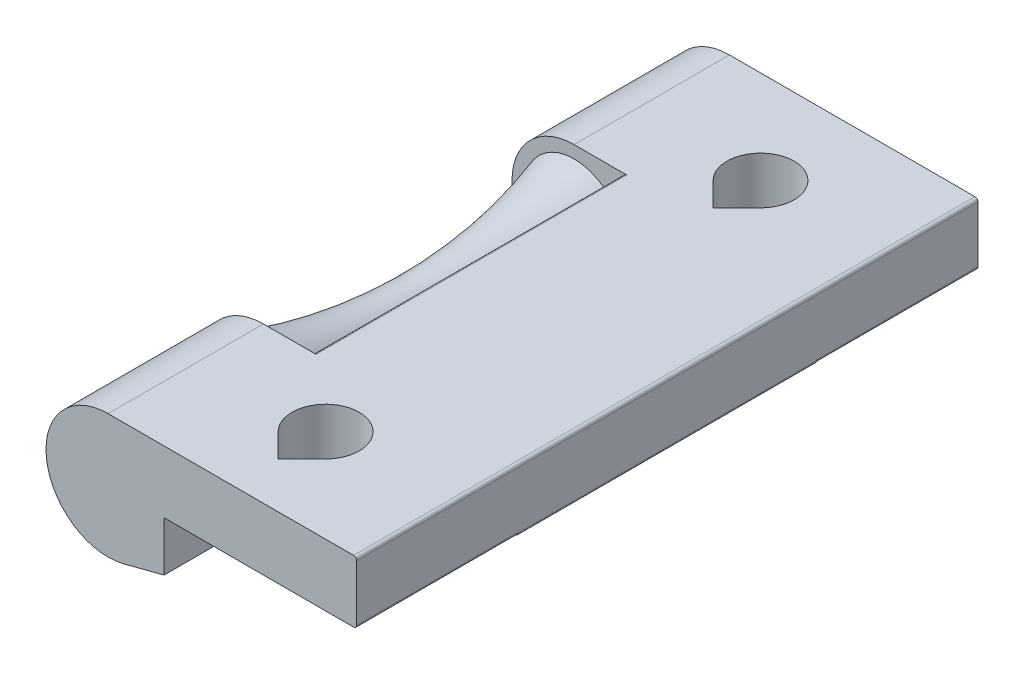
ISO-10303-21;
HEADER;
FILE_DESCRIPTION(('STEP AP214'),'2;1');
FILE_NAME('part.step','',(''),(''),'','','');
FILE_SCHEMA(('AUTOMOTIVE_DESIGN { 1 0 10303 214 1 1 1 1 }'));
ENDSEC;
DATA;
#1=APPLICATION_CONTEXT('core data for automotive mechanical design processes');
#2=APPLICATION_PROTOCOL_DEFINITION('international standard','automotive_design',2000,#1);
#3=PRODUCT_CONTEXT('',#1,'mechanical');
#4=PRODUCT('Part','Part','',(#3));
#5=PRODUCT_RELATED_PRODUCT_CATEGORY('part','',(#4));
#6=PRODUCT_DEFINITION_FORMATION('','',#4);
#7=PRODUCT_DEFINITION_CONTEXT('part definition',#1,'design');
#8=PRODUCT_DEFINITION('design','',#6,#7);
#9=PRODUCT_DEFINITION_SHAPE('','',#8);
#10=(LENGTH_UNIT() NAMED_UNIT(*) SI_UNIT(.MILLI.,.METRE.));
#11=(NAMED_UNIT(*) PLANE_ANGLE_UNIT() SI_UNIT($,.RADIAN.));
#12=(NAMED_UNIT(*) SI_UNIT($,.STERADIAN.) SOLID_ANGLE_UNIT());
#13=UNCERTAINTY_MEASURE_WITH_UNIT(LENGTH_MEASURE(1.E-05),#10,'distance_accuracy_value','');
#14=(GEOMETRIC_REPRESENTATION_CONTEXT(3) GLOBAL_UNCERTAINTY_ASSIGNED_CONTEXT((#13)) GLOBAL_UNIT_ASSIGNED_CONTEXT((#10,
#11,#12)) REPRESENTATION_CONTEXT('',''));
#15=CARTESIAN_POINT('',(0.,0.,0.));
#16=DIRECTION('',(0.,0.,1.));
#17=DIRECTION('',(1.,0.,0.));
#18=AXIS2_PLACEMENT_3D('',#15,#16,#17);
#19=CARTESIAN_POINT('',(4.,0.,12.5));
#20=DIRECTION('',(1.,0.,0.));
#21=DIRECTION('',(0.,0.,-1.));
#22=AXIS2_PLACEMENT_3D('',#19,#20,#21);
#23=PLANE('',#22);
#24=DIRECTION('',(0.,1.,0.));
#25=VECTOR('',#24,1.);
#26=CARTESIAN_POINT('',(4.,0.,-12.5));
#27=LINE('',#26,#25);
#28=CARTESIAN_POINT('',(4.,-3.80843362377065,-12.5));
#29=VERTEX_POINT('',#28);
#30=CARTESIAN_POINT('',(4.,-3.49106001094224,-12.5));
#31=VERTEX_POINT('',#30);
#32=EDGE_CURVE('E218',#29,#31,#27,.T.);
#33=ORIENTED_EDGE('',*,*,#32,.F.);
#34=DIRECTION('',(0.,0.,-1.));
#35=VECTOR('',#34,1.);
#36=CARTESIAN_POINT('',(4.,-3.80843362377064,-6.25));
#37=LINE('',#36,#35);
#38=CARTESIAN_POINT('',(4.,-3.80843362377064,12.5));
#39=VERTEX_POINT('',#38);
#40=EDGE_CURVE('E217',#39,#29,#37,.T.);
#41=ORIENTED_EDGE('',*,*,#40,.F.);
#42=DIRECTION('',(0.,1.,0.));
#43=VECTOR('',#42,1.);
#44=CARTESIAN_POINT('',(4.,0.,12.5));
#45=LINE('',#44,#43);
#46=CARTESIAN_POINT('',(4.,-3.49106001094224,12.5));
#47=VERTEX_POINT('',#46);
#48=EDGE_CURVE('E213',#47,#39,#45,.F.);
#49=ORIENTED_EDGE('',*,*,#48,.F.);
#50=DIRECTION('',(0.,0.,-1.));
#51=VECTOR('',#50,1.);
#52=CARTESIAN_POINT('',(4.,-3.49106001094224,0.));
#53=LINE('',#52,#51);
#54=EDGE_CURVE('E468',#31,#47,#53,.F.);
#55=ORIENTED_EDGE('',*,*,#54,.F.);
#56=EDGE_LOOP('',(#33,#41,#49,#55));
#57=FACE_BOUND('',#56,.T.);
#58=ADVANCED_FACE('F16',(#57),#23,.F.);
#59=CARTESIAN_POINT('',(19.75,0.193649167310371,-25.));
#60=DIRECTION('',(0.,0.,1.));
#61=DIRECTION('',(1.,0.,0.));
#62=AXIS2_PLACEMENT_3D('',#59,#60,#61);
#63=CYLINDRICAL_SURFACE('',#62,0.25);
#64=CARTESIAN_POINT('',(19.75,0.193649167310371,-12.));
#65=DIRECTION('',(0.,0.,1.));
#66=DIRECTION('',(1.,0.,0.));
#67=AXIS2_PLACEMENT_3D('',#64,#65,#66);
#68=CIRCLE('',#67,0.25);
#69=CARTESIAN_POINT('',(19.8125,-0.0484122918276004,-12.));
#70=VERTEX_POINT('',#69);
#71=CARTESIAN_POINT('',(20.,0.193649167310371,-12.));
#72=VERTEX_POINT('',#71);
#73=EDGE_CURVE('E459',#70,#72,#68,.T.);
#74=ORIENTED_EDGE('',*,*,#73,.T.);
#75=DIRECTION('',(0.,0.,-1.));
#76=VECTOR('',#75,1.);
#77=CARTESIAN_POINT('',(20.,0.193649167310371,-25.));
#78=LINE('',#77,#76);
#79=CARTESIAN_POINT('',(20.,0.193649167310371,12.));
#80=VERTEX_POINT('',#79);
#81=EDGE_CURVE('E556',#80,#72,#78,.T.);
#82=ORIENTED_EDGE('',*,*,#81,.F.);
#83=CARTESIAN_POINT('',(19.75,0.193649167310371,12.));
#84=DIRECTION('',(0.,0.,1.));
#85=DIRECTION('',(1.,0.,0.));
#86=AXIS2_PLACEMENT_3D('',#83,#84,#85);
#87=CIRCLE('',#86,0.25);
#88=CARTESIAN_POINT('',(19.8125,-0.0484122918275988,12.));
#89=VERTEX_POINT('',#88);
#90=EDGE_CURVE('E454',#80,#89,#87,.F.);
#91=ORIENTED_EDGE('',*,*,#90,.T.);
#92=DIRECTION('',(0.,0.,1.));
#93=VECTOR('',#92,1.);
#94=CARTESIAN_POINT('',(19.8125,-0.0484122918276014,-25.));
#95=LINE('',#94,#93);
#96=EDGE_CURVE('E557',#70,#89,#95,.T.);
#97=ORIENTED_EDGE('',*,*,#96,.F.);
#98=EDGE_LOOP('',(#74,#82,#91,#97));
#99=FACE_BOUND('',#98,.T.);
#100=ADVANCED_FACE('F354',(#99),#63,.T.);
#101=CARTESIAN_POINT('',(4.25,-3.80843362377065,-6.25));
#102=DIRECTION('',(0.,0.,-1.));
#103=DIRECTION('',(0.,1.,0.));
#104=AXIS2_PLACEMENT_3D('',#101,#102,#103);
#105=CYLINDRICAL_SURFACE('',#104,0.25);
#106=CARTESIAN_POINT('',(4.25,-3.80843362377065,-12.5));
#107=DIRECTION('',(0.,0.,-1.));
#108=DIRECTION('',(0.,1.,0.));
#109=AXIS2_PLACEMENT_3D('',#106,#107,#108);
#110=CIRCLE('',#109,0.25);
#111=CARTESIAN_POINT('',(4.3125,-4.05049508290861,-12.5));
#112=VERTEX_POINT('',#111);
#113=EDGE_CURVE('E223',#29,#112,#110,.F.);
#114=ORIENTED_EDGE('',*,*,#113,.T.);
#115=DIRECTION('',(0.,0.,1.));
#116=VECTOR('',#115,1.);
#117=CARTESIAN_POINT('',(4.3125,-4.05049508290862,-25.));
#118=LINE('',#117,#116);
#119=CARTESIAN_POINT('',(4.3125,-4.05049508290861,12.5));
#120=VERTEX_POINT('',#119);
#121=EDGE_CURVE('E220',#120,#112,#118,.F.);
#122=ORIENTED_EDGE('',*,*,#121,.F.);
#123=CARTESIAN_POINT('',(4.25,-3.80843362377065,12.5));
#124=DIRECTION('',(0.,0.,-1.));
#125=DIRECTION('',(0.,1.,0.));
#126=AXIS2_PLACEMENT_3D('',#123,#124,#125);
#127=CIRCLE('',#126,0.25);
#128=EDGE_CURVE('E19',#120,#39,#127,.T.);
#129=ORIENTED_EDGE('',*,*,#128,.T.);
#130=ORIENTED_EDGE('',*,*,#40,.T.);
#131=EDGE_LOOP('',(#114,#122,#129,#130));
#132=FACE_BOUND('',#131,.T.);
#133=ADVANCED_FACE('F221',(#132),#105,.T.);
#134=CARTESIAN_POINT('',(4.25,-3.49106001094224,0.));
#135=DIRECTION('',(0.,0.,-1.));
#136=DIRECTION('',(-1.,0.,0.));
#137=AXIS2_PLACEMENT_3D('',#134,#135,#136);
#138=CYLINDRICAL_SURFACE('',#137,0.25);
#139=CARTESIAN_POINT('',(4.25,-3.49106001094224,-12.5));
#140=DIRECTION('',(0.,0.,-1.));
#141=DIRECTION('',(-1.,0.,0.));
#142=AXIS2_PLACEMENT_3D('',#139,#140,#141);
#143=CIRCLE('',#142,0.25);
#144=CARTESIAN_POINT('',(4.05681818181818,-3.33237546499032,-12.5));
#145=VERTEX_POINT('',#144);
#146=EDGE_CURVE('E469',#145,#31,#143,.F.);
#147=ORIENTED_EDGE('',*,*,#146,.T.);
#148=ORIENTED_EDGE('',*,*,#54,.T.);
#149=CARTESIAN_POINT('',(4.25,-3.49106001094224,12.5));
#150=DIRECTION('',(0.,0.,-1.));
#151=DIRECTION('',(-1.,0.,0.));
#152=AXIS2_PLACEMENT_3D('',#149,#150,#151);
#153=CIRCLE('',#152,0.25);
#154=CARTESIAN_POINT('',(4.05681818181818,-3.33237546499032,12.5));
#155=VERTEX_POINT('',#154);
#156=EDGE_CURVE('E472',#47,#155,#153,.T.);
#157=ORIENTED_EDGE('',*,*,#156,.T.);
#158=DIRECTION('',(0.,0.,-1.));
#159=VECTOR('',#158,1.);
#160=CARTESIAN_POINT('',(4.05681818181818,-3.33237546499032,0.));
#161=LINE('',#160,#159);
#162=EDGE_CURVE('E226',#155,#145,#161,.T.);
#163=ORIENTED_EDGE('',*,*,#162,.T.);
#164=EDGE_LOOP('',(#147,#148,#157,#163));
#165=FACE_BOUND('',#164,.T.);
#166=ADVANCED_FACE('F348',(#165),#138,.T.);
#167=CARTESIAN_POINT('',(4.25,3.49106001094224,0.));
#168=DIRECTION('',(0.,0.,1.));
#169=DIRECTION('',(1.,0.,0.));
#170=AXIS2_PLACEMENT_3D('',#167,#168,#169);
#171=CYLINDRICAL_SURFACE('',#170,0.25);
#172=CARTESIAN_POINT('',(4.25,3.49106001094224,12.5));
#173=DIRECTION('',(0.,0.,1.));
#174=DIRECTION('',(1.,0.,0.));
#175=AXIS2_PLACEMENT_3D('',#172,#173,#174);
#176=CIRCLE('',#175,0.25);
#177=CARTESIAN_POINT('',(4.05681818181818,3.33237546499032,12.5));
#178=VERTEX_POINT('',#177);
#179=CARTESIAN_POINT('',(4.,3.49106001094224,12.5));
#180=VERTEX_POINT('',#179);
#181=EDGE_CURVE('E464',#178,#180,#176,.F.);
#182=ORIENTED_EDGE('',*,*,#181,.T.);
#183=DIRECTION('',(0.,0.,-1.));
#184=VECTOR('',#183,1.);
#185=CARTESIAN_POINT('',(4.,3.49106001094224,12.5));
#186=LINE('',#185,#184);
#187=CARTESIAN_POINT('',(4.,3.49106001094224,-12.5));
#188=VERTEX_POINT('',#187);
#189=EDGE_CURVE('E272',#180,#188,#186,.T.);
#190=ORIENTED_EDGE('',*,*,#189,.T.);
#191=CARTESIAN_POINT('',(4.25,3.49106001094224,-12.5));
#192=DIRECTION('',(0.,0.,1.));
#193=DIRECTION('',(1.,0.,0.));
#194=AXIS2_PLACEMENT_3D('',#191,#192,#193);
#195=CIRCLE('',#194,0.25);
#196=CARTESIAN_POINT('',(4.05681818181818,3.33237546499032,-12.5));
#197=VERTEX_POINT('',#196);
#198=EDGE_CURVE('E466',#188,#197,#195,.T.);
#199=ORIENTED_EDGE('',*,*,#198,.T.);
#200=DIRECTION('',(0.,0.,-1.));
#201=VECTOR('',#200,1.);
#202=CARTESIAN_POINT('',(4.05681818181818,3.33237546499032,0.));
#203=LINE('',#202,#201);
#204=EDGE_CURVE('E576',#197,#178,#203,.F.);
#205=ORIENTED_EDGE('',*,*,#204,.T.);
#206=EDGE_LOOP('',(#182,#190,#199,#205));
#207=FACE_BOUND('',#206,.T.);
#208=ADVANCED_FACE('F344',(#207),#171,.T.);
#209=CARTESIAN_POINT('',(10.,-5.,-17.5));
#210=DIRECTION('',(0.,1.,0.));
#211=DIRECTION('',(0.,0.,1.));
#212=AXIS2_PLACEMENT_3D('',#209,#210,#211);
#213=CYLINDRICAL_SURFACE('',#212,5.5);
#214=DIRECTION('',(0.,1.,0.));
#215=VECTOR('',#214,1.);
#216=CARTESIAN_POINT('',(4.5,-5.,-17.5));
#217=LINE('',#216,#215);
#218=CARTESIAN_POINT('',(4.5,-4.00208279108102,-17.5));
#219=VERTEX_POINT('',#218);
#220=CARTESIAN_POINT('',(4.5,0.,-17.5));
#221=VERTEX_POINT('',#220);
#222=EDGE_CURVE('E554',#219,#221,#217,.T.);
#223=ORIENTED_EDGE('',*,*,#222,.T.);
#224=CARTESIAN_POINT('',(10.,0.,-17.5));
#225=DIRECTION('',(0.,1.,0.));
#226=DIRECTION('',(0.,0.,1.));
#227=AXIS2_PLACEMENT_3D('',#224,#225,#226);
#228=CIRCLE('',#227,5.5);
#229=CARTESIAN_POINT('',(10.,0.,-12.));
#230=VERTEX_POINT('',#229);
#231=EDGE_CURVE('E268',#221,#230,#228,.T.);
#232=ORIENTED_EDGE('',*,*,#231,.T.);
#233=DIRECTION('',(0.,1.,0.));
#234=VECTOR('',#233,1.);
#235=CARTESIAN_POINT('',(10.,-5.,-12.));
#236=LINE('',#235,#234);
#237=CARTESIAN_POINT('',(10.,-2.58198889747163,-12.));
#238=VERTEX_POINT('',#237);
#239=EDGE_CURVE('E450',#230,#238,#236,.F.);
#240=ORIENTED_EDGE('',*,*,#239,.T.);
#241=CARTESIAN_POINT('',(10.,-2.58198889747163,-17.5));
#242=DIRECTION('',(0.250000000000001,-0.968245836551854,0.));
#243=DIRECTION('',(0.968245836551854,0.250000000000001,0.));
#244=AXIS2_PLACEMENT_3D('',#241,#242,#243);
#245=ELLIPSE('',#244,5.68037557443755,5.5);
#246=EDGE_CURVE('E536',#219,#238,#245,.F.);
#247=ORIENTED_EDGE('',*,*,#246,.F.);
#248=EDGE_LOOP('',(#223,#232,#240,#247));
#249=FACE_BOUND('',#248,.T.);
#250=ADVANCED_FACE('F340',(#249),#213,.F.);
#251=CARTESIAN_POINT('',(10.,-5.,-12.));
#252=DIRECTION('',(0.,0.,1.));
#253=DIRECTION('',(1.,0.,0.));
#254=AXIS2_PLACEMENT_3D('',#251,#252,#253);
#255=PLANE('',#254);
#256=DIRECTION('',(0.968245836551854,0.250000000000001,0.));
#257=VECTOR('',#256,1.);
#258=CARTESIAN_POINT('',(1.25000000000004,-4.84122918275929,-12.));
#259=LINE('',#258,#257);
#260=EDGE_CURVE('E539',#238,#70,#259,.T.);
#261=ORIENTED_EDGE('',*,*,#260,.F.);
#262=ORIENTED_EDGE('',*,*,#239,.F.);
#263=DIRECTION('',(1.,0.,0.));
#264=VECTOR('',#263,1.);
#265=CARTESIAN_POINT('',(12.2500001490116,0.,-12.));
#266=LINE('',#265,#264);
#267=CARTESIAN_POINT('',(19.75,0.,-12.));
#268=VERTEX_POINT('',#267);
#269=EDGE_CURVE('E266',#230,#268,#266,.T.);
#270=ORIENTED_EDGE('',*,*,#269,.T.);
#271=CARTESIAN_POINT('',(19.75,0.25,-12.));
#272=DIRECTION('',(0.,0.,1.));
#273=DIRECTION('',(1.,0.,0.));
#274=AXIS2_PLACEMENT_3D('',#271,#272,#273);
#275=CIRCLE('',#274,0.25);
#276=CARTESIAN_POINT('',(20.,0.25,-12.));
#277=VERTEX_POINT('',#276);
#278=EDGE_CURVE('E448',#277,#268,#275,.F.);
#279=ORIENTED_EDGE('',*,*,#278,.F.);
#280=DIRECTION('',(0.,1.,0.));
#281=VECTOR('',#280,1.);
#282=CARTESIAN_POINT('',(20.,0.,-12.));
#283=LINE('',#282,#281);
#284=EDGE_CURVE('E566',#72,#277,#283,.T.);
#285=ORIENTED_EDGE('',*,*,#284,.F.);
#286=ORIENTED_EDGE('',*,*,#73,.F.);
#287=EDGE_LOOP('',(#261,#262,#270,#279,#285,#286));
#288=FACE_BOUND('',#287,.T.);
#289=ADVANCED_FACE('F336',(#288),#255,.F.);
#290=CARTESIAN_POINT('',(19.75,0.25,-21.7500000931322));
#291=DIRECTION('',(0.,0.,1.));
#292=DIRECTION('',(1.,0.,0.));
#293=AXIS2_PLACEMENT_3D('',#290,#291,#292);
#294=CYLINDRICAL_SURFACE('',#293,0.25);
#295=ORIENTED_EDGE('',*,*,#278,.T.);
#296=DIRECTION('',(0.,0.,1.));
#297=VECTOR('',#296,1.);
#298=CARTESIAN_POINT('',(19.75,0.,-18.5000001862645));
#299=LINE('',#298,#297);
#300=CARTESIAN_POINT('',(19.75,0.,-25.));
#301=VERTEX_POINT('',#300);
#302=EDGE_CURVE('E251',#268,#301,#299,.F.);
#303=ORIENTED_EDGE('',*,*,#302,.T.);
#304=CARTESIAN_POINT('',(19.75,0.25,-25.));
#305=DIRECTION('',(0.,0.,1.));
#306=DIRECTION('',(1.,0.,0.));
#307=AXIS2_PLACEMENT_3D('',#304,#305,#306);
#308=CIRCLE('',#307,0.25);
#309=CARTESIAN_POINT('',(20.,0.25,-25.));
#310=VERTEX_POINT('',#309);
#311=EDGE_CURVE('E455',#301,#310,#308,.T.);
#312=ORIENTED_EDGE('',*,*,#311,.T.);
#313=DIRECTION('',(0.,0.,-1.));
#314=VECTOR('',#313,1.);
#315=CARTESIAN_POINT('',(20.,0.25,-25.));
#316=LINE('',#315,#314);
#317=EDGE_CURVE('E452',#277,#310,#316,.T.);
#318=ORIENTED_EDGE('',*,*,#317,.F.);
#319=EDGE_LOOP('',(#295,#303,#312,#318));
#320=FACE_BOUND('',#319,.T.);
#321=ADVANCED_FACE('F332',(#320),#294,.T.);
#322=CARTESIAN_POINT('',(20.0000002980232,-5.,12.));
#323=DIRECTION('',(0.,0.,-1.));
#324=DIRECTION('',(-1.,0.,0.));
#325=AXIS2_PLACEMENT_3D('',#322,#323,#324);
#326=PLANE('',#325);
#327=DIRECTION('',(0.,1.,0.));
#328=VECTOR('',#327,1.);
#329=CARTESIAN_POINT('',(20.,0.,12.));
#330=LINE('',#329,#328);
#331=CARTESIAN_POINT('',(20.,0.25,12.));
#332=VERTEX_POINT('',#331);
#333=EDGE_CURVE('E560',#332,#80,#330,.F.);
#334=ORIENTED_EDGE('',*,*,#333,.F.);
#335=CARTESIAN_POINT('',(19.75,0.25,12.));
#336=DIRECTION('',(0.,0.,1.));
#337=DIRECTION('',(1.,0.,0.));
#338=AXIS2_PLACEMENT_3D('',#335,#336,#337);
#339=CIRCLE('',#338,0.25);
#340=CARTESIAN_POINT('',(19.75,0.,12.));
#341=VERTEX_POINT('',#340);
#342=EDGE_CURVE('E541',#341,#332,#339,.T.);
#343=ORIENTED_EDGE('',*,*,#342,.F.);
#344=DIRECTION('',(1.,0.,0.));
#345=VECTOR('',#344,1.);
#346=CARTESIAN_POINT('',(12.2500001490116,0.,12.));
#347=LINE('',#346,#345);
#348=CARTESIAN_POINT('',(10.,0.,12.));
#349=VERTEX_POINT('',#348);
#350=EDGE_CURVE('E249',#341,#349,#347,.F.);
#351=ORIENTED_EDGE('',*,*,#350,.T.);
#352=DIRECTION('',(0.,1.,0.));
#353=VECTOR('',#352,1.);
#354=CARTESIAN_POINT('',(10.,-5.,12.));
#355=LINE('',#354,#353);
#356=CARTESIAN_POINT('',(10.,-2.58198889747162,12.));
#357=VERTEX_POINT('',#356);
#358=EDGE_CURVE('E457',#349,#357,#355,.F.);
#359=ORIENTED_EDGE('',*,*,#358,.T.);
#360=DIRECTION('',(0.968245836551854,0.250000000000001,0.));
#361=VECTOR('',#360,1.);
#362=CARTESIAN_POINT('',(1.25000000000004,-4.84122918275928,12.));
#363=LINE('',#362,#361);
#364=EDGE_CURVE('E535',#89,#357,#363,.F.);
#365=ORIENTED_EDGE('',*,*,#364,.F.);
#366=ORIENTED_EDGE('',*,*,#90,.F.);
#367=EDGE_LOOP('',(#334,#343,#351,#359,#365,#366));
#368=FACE_BOUND('',#367,.T.);
#369=ADVANCED_FACE('F328',(#368),#326,.F.);
#370=CARTESIAN_POINT('',(10.,-5.,17.5));
#371=DIRECTION('',(0.,1.,0.));
#372=DIRECTION('',(0.,0.,1.));
#373=AXIS2_PLACEMENT_3D('',#370,#371,#372);
#374=CYLINDRICAL_SURFACE('',#373,5.5);
#375=ORIENTED_EDGE('',*,*,#358,.F.);
#376=CARTESIAN_POINT('',(10.,0.,17.5));
#377=DIRECTION('',(0.,1.,0.));
#378=DIRECTION('',(0.,0.,1.));
#379=AXIS2_PLACEMENT_3D('',#376,#377,#378);
#380=CIRCLE('',#379,5.5);
#381=CARTESIAN_POINT('',(4.5,0.,17.5));
#382=VERTEX_POINT('',#381);
#383=EDGE_CURVE('E246',#349,#382,#380,.T.);
#384=ORIENTED_EDGE('',*,*,#383,.T.);
#385=DIRECTION('',(0.,1.,0.));
#386=VECTOR('',#385,1.);
#387=CARTESIAN_POINT('',(4.5,-5.,17.5));
#388=LINE('',#387,#386);
#389=CARTESIAN_POINT('',(4.5,-4.00208279108101,17.5));
#390=VERTEX_POINT('',#389);
#391=EDGE_CURVE('E542',#382,#390,#388,.F.);
#392=ORIENTED_EDGE('',*,*,#391,.T.);
#393=CARTESIAN_POINT('',(10.,-2.58198889747162,17.5));
#394=DIRECTION('',(0.250000000000001,-0.968245836551854,0.));
#395=DIRECTION('',(0.968245836551854,0.250000000000001,0.));
#396=AXIS2_PLACEMENT_3D('',#393,#394,#395);
#397=ELLIPSE('',#396,5.68037557443755,5.5);
#398=EDGE_CURVE('E532',#357,#390,#397,.F.);
#399=ORIENTED_EDGE('',*,*,#398,.F.);
#400=EDGE_LOOP('',(#375,#384,#392,#399));
#401=FACE_BOUND('',#400,.T.);
#402=ADVANCED_FACE('F324',(#401),#374,.F.);
#403=CARTESIAN_POINT('',(19.75,0.25,-3.24999990686773));
#404=DIRECTION('',(0.,0.,1.));
#405=DIRECTION('',(1.,0.,0.));
#406=AXIS2_PLACEMENT_3D('',#403,#404,#405);
#407=CYLINDRICAL_SURFACE('',#406,0.25);
#408=ORIENTED_EDGE('',*,*,#342,.T.);
#409=DIRECTION('',(0.,0.,-1.));
#410=VECTOR('',#409,1.);
#411=CARTESIAN_POINT('',(20.,0.25,-25.));
#412=LINE('',#411,#410);
#413=CARTESIAN_POINT('',(20.,0.25,25.0000001862645));
#414=VERTEX_POINT('',#413);
#415=EDGE_CURVE('E563',#414,#332,#412,.T.);
#416=ORIENTED_EDGE('',*,*,#415,.F.);
#417=CARTESIAN_POINT('',(19.75,0.25,25.));
#418=DIRECTION('',(0.,0.,1.));
#419=DIRECTION('',(1.,0.,0.));
#420=AXIS2_PLACEMENT_3D('',#417,#418,#419);
#421=CIRCLE('',#420,0.25);
#422=CARTESIAN_POINT('',(19.75,0.,25.0000001862645));
#423=VERTEX_POINT('',#422);
#424=EDGE_CURVE('E543',#414,#423,#421,.F.);
#425=ORIENTED_EDGE('',*,*,#424,.T.);
#426=DIRECTION('',(0.,0.,1.));
#427=VECTOR('',#426,1.);
#428=CARTESIAN_POINT('',(19.75,0.,18.5000001862645));
#429=LINE('',#428,#427);
#430=EDGE_CURVE('E234',#423,#341,#429,.F.);
#431=ORIENTED_EDGE('',*,*,#430,.T.);
#432=EDGE_LOOP('',(#408,#416,#425,#431));
#433=FACE_BOUND('',#432,.T.);
#434=ADVANCED_FACE('F320',(#433),#407,.T.);
#435=CARTESIAN_POINT('',(4.5,-5.,17.5));
#436=DIRECTION('',(-1.,0.,0.));
#437=DIRECTION('',(0.,0.,1.));
#438=AXIS2_PLACEMENT_3D('',#435,#436,#437);
#439=PLANE('',#438);
#440=ORIENTED_EDGE('',*,*,#391,.F.);
#441=DIRECTION('',(0.,0.,1.));
#442=VECTOR('',#441,1.);
#443=CARTESIAN_POINT('',(4.5,0.,18.5000001862645));
#444=LINE('',#443,#442);
#445=CARTESIAN_POINT('',(4.5,0.,25.000000372529));
#446=VERTEX_POINT('',#445);
#447=EDGE_CURVE('E240',#382,#446,#444,.T.);
#448=ORIENTED_EDGE('',*,*,#447,.T.);
#449=DIRECTION('',(0.,1.,0.));
#450=VECTOR('',#449,1.);
#451=CARTESIAN_POINT('',(4.5,0.,25.000000372529));
#452=LINE('',#451,#450);
#453=CARTESIAN_POINT('',(4.5,-4.00208279108101,25.000000372529));
#454=VERTEX_POINT('',#453);
#455=EDGE_CURVE('E621',#454,#446,#452,.T.);
#456=ORIENTED_EDGE('',*,*,#455,.F.);
#457=DIRECTION('',(0.,0.,1.));
#458=VECTOR('',#457,1.);
#459=CARTESIAN_POINT('',(4.5,-4.00208279108102,-25.));
#460=LINE('',#459,#458);
#461=EDGE_CURVE('E227',#390,#454,#460,.T.);
#462=ORIENTED_EDGE('',*,*,#461,.F.);
#463=EDGE_LOOP('',(#440,#448,#456,#462));
#464=FACE_BOUND('',#463,.T.);
#465=ADVANCED_FACE('F316',(#464),#439,.F.);
#466=CARTESIAN_POINT('',(4.5,-5.,-25.000000372529));
#467=DIRECTION('',(-1.,0.,0.));
#468=DIRECTION('',(0.,0.,1.));
#469=AXIS2_PLACEMENT_3D('',#466,#467,#468);
#470=PLANE('',#469);
#471=DIRECTION('',(0.,1.,0.));
#472=VECTOR('',#471,1.);
#473=CARTESIAN_POINT('',(4.5,0.,-25.));
#474=LINE('',#473,#472);
#475=CARTESIAN_POINT('',(4.5,0.,-25.));
#476=VERTEX_POINT('',#475);
#477=CARTESIAN_POINT('',(4.5,-4.00208279108102,-25.));
#478=VERTEX_POINT('',#477);
#479=EDGE_CURVE('E605',#476,#478,#474,.F.);
#480=ORIENTED_EDGE('',*,*,#479,.F.);
#481=DIRECTION('',(0.,0.,1.));
#482=VECTOR('',#481,1.);
#483=CARTESIAN_POINT('',(4.5,0.,-18.5000001862645));
#484=LINE('',#483,#482);
#485=EDGE_CURVE('E269',#476,#221,#484,.T.);
#486=ORIENTED_EDGE('',*,*,#485,.T.);
#487=ORIENTED_EDGE('',*,*,#222,.F.);
#488=DIRECTION('',(0.,0.,1.));
#489=VECTOR('',#488,1.);
#490=CARTESIAN_POINT('',(4.5,-4.00208279108102,-25.));
#491=LINE('',#490,#489);
#492=EDGE_CURVE('E540',#478,#219,#491,.T.);
#493=ORIENTED_EDGE('',*,*,#492,.F.);
#494=EDGE_LOOP('',(#480,#486,#487,#493));
#495=FACE_BOUND('',#494,.T.);
#496=ADVANCED_FACE('F312',(#495),#470,.F.);
#497=CARTESIAN_POINT('',(20.,0.,-25.));
#498=DIRECTION('',(1.,0.,0.));
#499=DIRECTION('',(0.,0.,-1.));
#500=AXIS2_PLACEMENT_3D('',#497,#498,#499);
#501=PLANE('',#500);
#502=ORIENTED_EDGE('',*,*,#415,.T.);
#503=ORIENTED_EDGE('',*,*,#333,.T.);
#504=ORIENTED_EDGE('',*,*,#81,.T.);
#505=ORIENTED_EDGE('',*,*,#284,.T.);
#506=ORIENTED_EDGE('',*,*,#317,.T.);
#507=DIRECTION('',(0.,1.,0.));
#508=VECTOR('',#507,1.);
#509=CARTESIAN_POINT('',(20.,0.,-25.));
#510=LINE('',#509,#508);
#511=CARTESIAN_POINT('',(20.,4.75000000000002,-25.));
#512=VERTEX_POINT('',#511);
#513=EDGE_CURVE('E508',#512,#310,#510,.F.);
#514=ORIENTED_EDGE('',*,*,#513,.F.);
#515=DIRECTION('',(0.,0.,1.));
#516=VECTOR('',#515,1.);
#517=CARTESIAN_POINT('',(20.,4.75000000000002,-25.));
#518=LINE('',#517,#516);
#519=CARTESIAN_POINT('',(20.,4.75000000000002,25.0000001862645));
#520=VERTEX_POINT('',#519);
#521=EDGE_CURVE('E516',#520,#512,#518,.F.);
#522=ORIENTED_EDGE('',*,*,#521,.F.);
#523=DIRECTION('',(0.,1.,0.));
#524=VECTOR('',#523,1.);
#525=CARTESIAN_POINT('',(20.,0.,25.000000372529));
#526=LINE('',#525,#524);
#527=EDGE_CURVE('E522',#414,#520,#526,.T.);
#528=ORIENTED_EDGE('',*,*,#527,.F.);
#529=EDGE_LOOP('',(#502,#503,#504,#505,#506,#514,#522,#528));
#530=FACE_BOUND('',#529,.T.);
#531=ADVANCED_FACE('F309',(#530),#501,.T.);
#532=CARTESIAN_POINT('',(1.25000000000004,-4.84122918275929,-25.));
#533=DIRECTION('',(0.250000000000001,-0.968245836551854,0.));
#534=DIRECTION('',(0.968245836551854,0.250000000000001,0.));
#535=AXIS2_PLACEMENT_3D('',#532,#533,#534);
#536=PLANE('',#535);
#537=DIRECTION('',(-0.968245836551854,-0.25,0.));
#538=VECTOR('',#537,1.);
#539=CARTESIAN_POINT('',(4.3125,-4.05049508290861,12.5));
#540=LINE('',#539,#538);
#541=CARTESIAN_POINT('',(1.24999999999999,-4.84122918275927,12.5));
#542=VERTEX_POINT('',#541);
#543=EDGE_CURVE('E210',#120,#542,#540,.T.);
#544=ORIENTED_EDGE('',*,*,#543,.F.);
#545=ORIENTED_EDGE('',*,*,#121,.T.);
#546=DIRECTION('',(0.968245836551854,0.250000000000001,0.));
#547=VECTOR('',#546,1.);
#548=CARTESIAN_POINT('',(1.25000000000002,-4.84122918275929,-12.5));
#549=LINE('',#548,#547);
#550=CARTESIAN_POINT('',(1.25000000000003,-4.84122918275929,-12.5));
#551=VERTEX_POINT('',#550);
#552=EDGE_CURVE('E504',#551,#112,#549,.T.);
#553=ORIENTED_EDGE('',*,*,#552,.F.);
#554=DIRECTION('',(0.,0.,-1.));
#555=VECTOR('',#554,1.);
#556=CARTESIAN_POINT('',(1.25000000000004,-4.84122918275929,-18.75));
#557=LINE('',#556,#555);
#558=CARTESIAN_POINT('',(1.25000000000004,-4.84122918275929,-25.));
#559=VERTEX_POINT('',#558);
#560=EDGE_CURVE('E293',#559,#551,#557,.F.);
#561=ORIENTED_EDGE('',*,*,#560,.F.);
#562=DIRECTION('',(-0.968245836551854,-0.250000000000002,0.));
#563=VECTOR('',#562,1.);
#564=CARTESIAN_POINT('',(4.5,-4.00208279108102,-25.));
#565=LINE('',#564,#563);
#566=EDGE_CURVE('E512',#478,#559,#565,.T.);
#567=ORIENTED_EDGE('',*,*,#566,.F.);
#568=ORIENTED_EDGE('',*,*,#492,.T.);
#569=ORIENTED_EDGE('',*,*,#246,.T.);
#570=ORIENTED_EDGE('',*,*,#260,.T.);
#571=ORIENTED_EDGE('',*,*,#96,.T.);
#572=ORIENTED_EDGE('',*,*,#364,.T.);
#573=ORIENTED_EDGE('',*,*,#398,.T.);
#574=ORIENTED_EDGE('',*,*,#461,.T.);
#575=DIRECTION('',(0.968245836551854,0.250000000000001,0.));
#576=VECTOR('',#575,1.);
#577=CARTESIAN_POINT('',(1.24999999999999,-4.84122918275929,25.000000372529));
#578=LINE('',#577,#576);
#579=CARTESIAN_POINT('',(1.24999999999998,-4.84122918275926,25.0000001862645));
#580=VERTEX_POINT('',#579);
#581=EDGE_CURVE('E521',#580,#454,#578,.T.);
#582=ORIENTED_EDGE('',*,*,#581,.F.);
#583=DIRECTION('',(0.,0.,-1.));
#584=VECTOR('',#583,1.);
#585=CARTESIAN_POINT('',(1.24999999999998,-4.84122918275925,18.7500001862645));
#586=LINE('',#585,#584);
#587=EDGE_CURVE('E231',#542,#580,#586,.F.);
#588=ORIENTED_EDGE('',*,*,#587,.F.);
#589=EDGE_LOOP('',(#544,#545,#553,#561,#567,#568,#569,#570,#571,#572,#573,#574,#582,#588));
#590=FACE_BOUND('',#589,.T.);
#591=ADVANCED_FACE('F229',(#590),#536,.T.);
#592=CARTESIAN_POINT('',(0.,0.,0.));
#593=DIRECTION('',(0.,0.,-1.));
#594=DIRECTION('',(-1.,0.,0.));
#595=AXIS2_PLACEMENT_3D('',#592,#593,#594);
#596=CYLINDRICAL_SURFACE('',#595,5.25);
#597=CARTESIAN_POINT('',(0.,0.,-12.5));
#598=DIRECTION('',(0.,0.,-1.));
#599=DIRECTION('',(-1.,0.,0.));
#600=AXIS2_PLACEMENT_3D('',#597,#598,#599);
#601=CIRCLE('',#600,5.25);
#602=EDGE_CURVE('E501',#145,#197,#601,.F.);
#603=ORIENTED_EDGE('',*,*,#602,.F.);
#604=ORIENTED_EDGE('',*,*,#162,.F.);
#605=CARTESIAN_POINT('',(0.,0.,12.5));
#606=DIRECTION('',(0.,0.,-1.));
#607=DIRECTION('',(-1.,0.,0.));
#608=AXIS2_PLACEMENT_3D('',#605,#606,#607);
#609=CIRCLE('',#608,5.25);
#610=EDGE_CURVE('E237',#178,#155,#609,.T.);
#611=ORIENTED_EDGE('',*,*,#610,.F.);
#612=ORIENTED_EDGE('',*,*,#204,.F.);
#613=EDGE_LOOP('',(#603,#604,#611,#612));
#614=FACE_BOUND('',#613,.T.);
#615=ADVANCED_FACE('F301',(#614),#596,.F.);
#616=CARTESIAN_POINT('',(0.,0.,0.));
#617=DIRECTION('',(0.,0.,-1.));
#618=DIRECTION('',(-1.,0.,0.));
#619=AXIS2_PLACEMENT_3D('',#616,#617,#618);
#620=TOROIDAL_SURFACE('',#619,43.0625,41.0137648387709);
#621=CARTESIAN_POINT('',(0.,0.,-12.5));
#622=DIRECTION('',(0.,0.,-1.));
#623=DIRECTION('',(-1.,0.,0.));
#624=AXIS2_PLACEMENT_3D('',#621,#622,#623);
#625=CIRCLE('',#624,4.00000000000001);
#626=CARTESIAN_POINT('',(-4.,0.,-12.5));
#627=VERTEX_POINT('',#626);
#628=EDGE_CURVE('E494',#627,#627,#625,.T.);
#629=ORIENTED_EDGE('',*,*,#628,.F.);
#630=EDGE_LOOP('',(#629));
#631=FACE_BOUND('',#630,.T.);
#632=CARTESIAN_POINT('',(0.,0.,12.5));
#633=DIRECTION('',(0.,0.,-1.));
#634=DIRECTION('',(-1.,0.,0.));
#635=AXIS2_PLACEMENT_3D('',#632,#633,#634);
#636=CIRCLE('',#635,4.);
#637=CARTESIAN_POINT('',(-4.00000000000001,0.,12.5));
#638=VERTEX_POINT('',#637);
#639=EDGE_CURVE('E525',#638,#638,#636,.F.);
#640=ORIENTED_EDGE('',*,*,#639,.F.);
#641=EDGE_LOOP('',(#640));
#642=FACE_BOUND('',#641,.T.);
#643=ADVANCED_FACE('F296',(#631,#642),#620,.F.);
#644=CARTESIAN_POINT('',(4.,0.,12.5));
#645=DIRECTION('',(1.,0.,0.));
#646=DIRECTION('',(0.,0.,-1.));
#647=AXIS2_PLACEMENT_3D('',#644,#645,#646);
#648=PLANE('',#647);
#649=DIRECTION('',(0.,1.,0.));
#650=VECTOR('',#649,1.);
#651=CARTESIAN_POINT('',(4.,0.,12.5));
#652=LINE('',#651,#650);
#653=CARTESIAN_POINT('',(4.,4.75000000000002,12.5));
#654=VERTEX_POINT('',#653);
#655=EDGE_CURVE('E233',#654,#180,#652,.F.);
#656=ORIENTED_EDGE('',*,*,#655,.F.);
#657=DIRECTION('',(0.,0.,1.));
#658=VECTOR('',#657,1.);
#659=CARTESIAN_POINT('',(4.,4.75000000000002,-6.24999999999999));
#660=LINE('',#659,#658);
#661=CARTESIAN_POINT('',(4.,4.75000000000002,-12.5));
#662=VERTEX_POINT('',#661);
#663=EDGE_CURVE('E287',#662,#654,#660,.T.);
#664=ORIENTED_EDGE('',*,*,#663,.F.);
#665=DIRECTION('',(0.,1.,0.));
#666=VECTOR('',#665,1.);
#667=CARTESIAN_POINT('',(4.,0.,-12.5));
#668=LINE('',#667,#666);
#669=EDGE_CURVE('E500',#188,#662,#668,.T.);
#670=ORIENTED_EDGE('',*,*,#669,.F.);
#671=ORIENTED_EDGE('',*,*,#189,.F.);
#672=EDGE_LOOP('',(#656,#664,#670,#671));
#673=FACE_BOUND('',#672,.T.);
#674=ADVANCED_FACE('F300',(#673),#648,.F.);
#675=CARTESIAN_POINT('',(12.2500001490116,0.,-18.5000001862645));
#676=DIRECTION('',(0.,1.,0.));
#677=DIRECTION('',(0.,0.,1.));
#678=AXIS2_PLACEMENT_3D('',#675,#676,#677);
#679=PLANE('',#678);
#680=DIRECTION('',(0.70710678118654,0.,0.707106781186555));
#681=VECTOR('',#680,1.);
#682=CARTESIAN_POINT('',(8.0908116907963,0.,-15.5908116907963));
#683=LINE('',#682,#681);
#684=CARTESIAN_POINT('',(8.0908116907963,0.,-15.5908116907963));
#685=VERTEX_POINT('',#684);
#686=CARTESIAN_POINT('',(9.99999999999999,0.,-13.6816233815926));
#687=VERTEX_POINT('',#686);
#688=EDGE_CURVE('E280',#685,#687,#683,.T.);
#689=ORIENTED_EDGE('',*,*,#688,.T.);
#690=DIRECTION('',(0.70710678118654,0.,-0.707106781186555));
#691=VECTOR('',#690,1.);
#692=CARTESIAN_POINT('',(10.,0.,-13.6816233815926));
#693=LINE('',#692,#691);
#694=CARTESIAN_POINT('',(11.9091883092037,0.,-15.5908116907963));
#695=VERTEX_POINT('',#694);
#696=EDGE_CURVE('E263',#687,#695,#693,.T.);
#697=ORIENTED_EDGE('',*,*,#696,.T.);
#698=CARTESIAN_POINT('',(10.,0.,-17.5));
#699=DIRECTION('',(0.,1.,0.));
#700=DIRECTION('',(0.,0.,1.));
#701=AXIS2_PLACEMENT_3D('',#698,#699,#700);
#702=CIRCLE('',#701,2.7);
#703=EDGE_CURVE('E487',#695,#685,#702,.T.);
#704=ORIENTED_EDGE('',*,*,#703,.T.);
#705=EDGE_LOOP('',(#689,#697,#704));
#706=FACE_BOUND('',#705,.T.);
#707=ORIENTED_EDGE('',*,*,#269,.F.);
#708=ORIENTED_EDGE('',*,*,#231,.F.);
#709=ORIENTED_EDGE('',*,*,#485,.F.);
#710=DIRECTION('',(-1.,0.,0.));
#711=VECTOR('',#710,1.);
#712=CARTESIAN_POINT('',(0.,0.,-25.));
#713=LINE('',#712,#711);
#714=EDGE_CURVE('E608',#301,#476,#713,.T.);
#715=ORIENTED_EDGE('',*,*,#714,.F.);
#716=ORIENTED_EDGE('',*,*,#302,.F.);
#717=EDGE_LOOP('',(#707,#708,#709,#715,#716));
#718=FACE_BOUND('',#717,.T.);
#719=ADVANCED_FACE('F427',(#706,#718),#679,.F.);
#720=CARTESIAN_POINT('',(12.2500001490116,0.,18.5000001862645));
#721=DIRECTION('',(0.,1.,0.));
#722=DIRECTION('',(0.,0.,1.));
#723=AXIS2_PLACEMENT_3D('',#720,#721,#722);
#724=PLANE('',#723);
#725=DIRECTION('',(0.70710678118654,0.,0.707106781186555));
#726=VECTOR('',#725,1.);
#727=CARTESIAN_POINT('',(8.0908116907963,0.,19.4091883092037));
#728=LINE('',#727,#726);
#729=CARTESIAN_POINT('',(8.0908116907963,0.,19.4091883092037));
#730=VERTEX_POINT('',#729);
#731=CARTESIAN_POINT('',(9.99999999999999,0.,21.3183766184074));
#732=VERTEX_POINT('',#731);
#733=EDGE_CURVE('E259',#730,#732,#728,.T.);
#734=ORIENTED_EDGE('',*,*,#733,.T.);
#735=DIRECTION('',(0.70710678118654,0.,-0.707106781186555));
#736=VECTOR('',#735,1.);
#737=CARTESIAN_POINT('',(10.,0.,21.3183766184074));
#738=LINE('',#737,#736);
#739=CARTESIAN_POINT('',(11.9091883092037,0.,19.4091883092037));
#740=VERTEX_POINT('',#739);
#741=EDGE_CURVE('E252',#732,#740,#738,.T.);
#742=ORIENTED_EDGE('',*,*,#741,.T.);
#743=CARTESIAN_POINT('',(10.,0.,17.5));
#744=DIRECTION('',(0.,1.,0.));
#745=DIRECTION('',(0.,0.,1.));
#746=AXIS2_PLACEMENT_3D('',#743,#744,#745);
#747=CIRCLE('',#746,2.7);
#748=EDGE_CURVE('E484',#740,#730,#747,.T.);
#749=ORIENTED_EDGE('',*,*,#748,.T.);
#750=EDGE_LOOP('',(#734,#742,#749));
#751=FACE_BOUND('',#750,.T.);
#752=DIRECTION('',(1.,0.,0.));
#753=VECTOR('',#752,1.);
#754=CARTESIAN_POINT('',(-5.,0.,25.000000372529));
#755=LINE('',#754,#753);
#756=EDGE_CURVE('E517',#446,#423,#755,.T.);
#757=ORIENTED_EDGE('',*,*,#756,.F.);
#758=ORIENTED_EDGE('',*,*,#447,.F.);
#759=ORIENTED_EDGE('',*,*,#383,.F.);
#760=ORIENTED_EDGE('',*,*,#350,.F.);
#761=ORIENTED_EDGE('',*,*,#430,.F.);
#762=EDGE_LOOP('',(#757,#758,#759,#760,#761));
#763=FACE_BOUND('',#762,.T.);
#764=ADVANCED_FACE('F424',(#751,#763),#724,.F.);
#765=CARTESIAN_POINT('',(-4.,0.,12.5));
#766=DIRECTION('',(0.,0.,-1.));
#767=DIRECTION('',(-1.,0.,0.));
#768=AXIS2_PLACEMENT_3D('',#765,#766,#767);
#769=PLANE('',#768);
#770=ORIENTED_EDGE('',*,*,#639,.T.);
#771=EDGE_LOOP('',(#770));
#772=FACE_BOUND('',#771,.T.);
#773=ORIENTED_EDGE('',*,*,#48,.T.);
#774=ORIENTED_EDGE('',*,*,#128,.F.);
#775=ORIENTED_EDGE('',*,*,#543,.T.);
#776=CARTESIAN_POINT('',(0.,0.,12.5));
#777=DIRECTION('',(0.,0.,-1.));
#778=DIRECTION('',(-1.,0.,0.));
#779=AXIS2_PLACEMENT_3D('',#776,#777,#778);
#780=CIRCLE('',#779,4.99999999999998);
#781=CARTESIAN_POINT('',(0.,5.00000000000002,12.5));
#782=VERTEX_POINT('',#781);
#783=EDGE_CURVE('E523',#782,#542,#780,.F.);
#784=ORIENTED_EDGE('',*,*,#783,.F.);
#785=DIRECTION('',(1.,0.,0.));
#786=VECTOR('',#785,1.);
#787=CARTESIAN_POINT('',(20.,5.00000000000002,12.5));
#788=LINE('',#787,#786);
#789=CARTESIAN_POINT('',(4.25,5.00000000000002,12.5));
#790=VERTEX_POINT('',#789);
#791=EDGE_CURVE('E255',#790,#782,#788,.F.);
#792=ORIENTED_EDGE('',*,*,#791,.F.);
#793=CARTESIAN_POINT('',(4.25,4.75000000000002,12.5));
#794=DIRECTION('',(0.,0.,1.));
#795=DIRECTION('',(1.,0.,0.));
#796=AXIS2_PLACEMENT_3D('',#793,#794,#795);
#797=CIRCLE('',#796,0.25);
#798=EDGE_CURVE('E284',#654,#790,#797,.F.);
#799=ORIENTED_EDGE('',*,*,#798,.F.);
#800=ORIENTED_EDGE('',*,*,#655,.T.);
#801=ORIENTED_EDGE('',*,*,#181,.F.);
#802=ORIENTED_EDGE('',*,*,#610,.T.);
#803=ORIENTED_EDGE('',*,*,#156,.F.);
#804=EDGE_LOOP('',(#773,#774,#775,#784,#792,#799,#800,#801,#802,#803));
#805=FACE_BOUND('',#804,.T.);
#806=ADVANCED_FACE('F208',(#772,#805),#769,.T.);
#807=CARTESIAN_POINT('',(0.,0.,18.7500001862645));
#808=DIRECTION('',(0.,0.,-1.));
#809=DIRECTION('',(-1.,0.,0.));
#810=AXIS2_PLACEMENT_3D('',#807,#808,#809);
#811=CYLINDRICAL_SURFACE('',#810,4.99999999999998);
#812=ORIENTED_EDGE('',*,*,#587,.T.);
#813=CARTESIAN_POINT('',(0.,0.,25.));
#814=DIRECTION('',(0.,0.,-1.));
#815=DIRECTION('',(-1.,0.,0.));
#816=AXIS2_PLACEMENT_3D('',#813,#814,#815);
#817=CIRCLE('',#816,4.99999999999998);
#818=CARTESIAN_POINT('',(0.,5.00000000000002,25.));
#819=VERTEX_POINT('',#818);
#820=EDGE_CURVE('E518',#819,#580,#817,.F.);
#821=ORIENTED_EDGE('',*,*,#820,.F.);
#822=DIRECTION('',(0.,0.,1.));
#823=VECTOR('',#822,1.);
#824=CARTESIAN_POINT('',(0.,5.00000000000002,-25.));
#825=LINE('',#824,#823);
#826=EDGE_CURVE('E618',#782,#819,#825,.T.);
#827=ORIENTED_EDGE('',*,*,#826,.F.);
#828=ORIENTED_EDGE('',*,*,#783,.T.);
#829=EDGE_LOOP('',(#812,#821,#827,#828));
#830=FACE_BOUND('',#829,.T.);
#831=ADVANCED_FACE('F417',(#830),#811,.T.);
#832=CARTESIAN_POINT('',(-5.,0.,25.000000372529));
#833=DIRECTION('',(0.,0.,1.));
#834=DIRECTION('',(1.,0.,0.));
#835=AXIS2_PLACEMENT_3D('',#832,#833,#834);
#836=PLANE('',#835);
#837=ORIENTED_EDGE('',*,*,#455,.T.);
#838=ORIENTED_EDGE('',*,*,#756,.T.);
#839=ORIENTED_EDGE('',*,*,#424,.F.);
#840=ORIENTED_EDGE('',*,*,#527,.T.);
#841=CARTESIAN_POINT('',(19.75,4.75000000000002,25.));
#842=DIRECTION('',(0.,0.,1.));
#843=DIRECTION('',(1.,0.,0.));
#844=AXIS2_PLACEMENT_3D('',#841,#842,#843);
#845=CIRCLE('',#844,0.25);
#846=CARTESIAN_POINT('',(19.75,5.00000000000002,25.));
#847=VERTEX_POINT('',#846);
#848=EDGE_CURVE('E513',#847,#520,#845,.F.);
#849=ORIENTED_EDGE('',*,*,#848,.F.);
#850=DIRECTION('',(1.,0.,0.));
#851=VECTOR('',#850,1.);
#852=CARTESIAN_POINT('',(20.,5.00000000000002,25.));
#853=LINE('',#852,#851);
#854=EDGE_CURVE('E615',#819,#847,#853,.T.);
#855=ORIENTED_EDGE('',*,*,#854,.F.);
#856=ORIENTED_EDGE('',*,*,#820,.T.);
#857=ORIENTED_EDGE('',*,*,#581,.T.);
#858=EDGE_LOOP('',(#837,#838,#839,#840,#849,#855,#856,#857));
#859=FACE_BOUND('',#858,.T.);
#860=ADVANCED_FACE('F413',(#859),#836,.T.);
#861=CARTESIAN_POINT('',(19.75,4.75000000000002,-25.));
#862=DIRECTION('',(0.,0.,1.));
#863=DIRECTION('',(1.,0.,0.));
#864=AXIS2_PLACEMENT_3D('',#861,#862,#863);
#865=CYLINDRICAL_SURFACE('',#864,0.25);
#866=CARTESIAN_POINT('',(19.75,4.75000000000002,-25.));
#867=DIRECTION('',(0.,0.,1.));
#868=DIRECTION('',(1.,0.,0.));
#869=AXIS2_PLACEMENT_3D('',#866,#867,#868);
#870=CIRCLE('',#869,0.25);
#871=CARTESIAN_POINT('',(19.75,5.00000000000002,-25.));
#872=VERTEX_POINT('',#871);
#873=EDGE_CURVE('E509',#872,#512,#870,.F.);
#874=ORIENTED_EDGE('',*,*,#873,.F.);
#875=DIRECTION('',(0.,0.,1.));
#876=VECTOR('',#875,1.);
#877=CARTESIAN_POINT('',(19.75,5.00000000000002,-25.));
#878=LINE('',#877,#876);
#879=EDGE_CURVE('E601',#847,#872,#878,.F.);
#880=ORIENTED_EDGE('',*,*,#879,.F.);
#881=ORIENTED_EDGE('',*,*,#848,.T.);
#882=ORIENTED_EDGE('',*,*,#521,.T.);
#883=EDGE_LOOP('',(#874,#880,#881,#882));
#884=FACE_BOUND('',#883,.T.);
#885=ADVANCED_FACE('F409',(#884),#865,.T.);
#886=CARTESIAN_POINT('',(0.,0.,-25.));
#887=DIRECTION('',(0.,0.,-1.));
#888=DIRECTION('',(-1.,0.,0.));
#889=AXIS2_PLACEMENT_3D('',#886,#887,#888);
#890=PLANE('',#889);
#891=ORIENTED_EDGE('',*,*,#873,.T.);
#892=ORIENTED_EDGE('',*,*,#513,.T.);
#893=ORIENTED_EDGE('',*,*,#311,.F.);
#894=ORIENTED_EDGE('',*,*,#714,.T.);
#895=ORIENTED_EDGE('',*,*,#479,.T.);
#896=ORIENTED_EDGE('',*,*,#566,.T.);
#897=CARTESIAN_POINT('',(0.,0.,-25.));
#898=DIRECTION('',(0.,0.,-1.));
#899=DIRECTION('',(-1.,0.,0.));
#900=AXIS2_PLACEMENT_3D('',#897,#898,#899);
#901=CIRCLE('',#900,5.00000000000002);
#902=CARTESIAN_POINT('',(0.,5.00000000000002,-25.));
#903=VERTEX_POINT('',#902);
#904=EDGE_CURVE('E505',#903,#559,#901,.F.);
#905=ORIENTED_EDGE('',*,*,#904,.F.);
#906=DIRECTION('',(1.,0.,0.));
#907=VECTOR('',#906,1.);
#908=CARTESIAN_POINT('',(20.,5.00000000000002,-25.));
#909=LINE('',#908,#907);
#910=EDGE_CURVE('E593',#872,#903,#909,.F.);
#911=ORIENTED_EDGE('',*,*,#910,.F.);
#912=EDGE_LOOP('',(#891,#892,#893,#894,#895,#896,#905,#911));
#913=FACE_BOUND('',#912,.T.);
#914=ADVANCED_FACE('F405',(#913),#890,.T.);
#915=CARTESIAN_POINT('',(0.,0.,-18.75));
#916=DIRECTION('',(0.,0.,-1.));
#917=DIRECTION('',(-1.,0.,0.));
#918=AXIS2_PLACEMENT_3D('',#915,#916,#917);
#919=CYLINDRICAL_SURFACE('',#918,5.00000000000002);
#920=ORIENTED_EDGE('',*,*,#560,.T.);
#921=CARTESIAN_POINT('',(0.,0.,-12.5));
#922=DIRECTION('',(0.,0.,-1.));
#923=DIRECTION('',(-1.,0.,0.));
#924=AXIS2_PLACEMENT_3D('',#921,#922,#923);
#925=CIRCLE('',#924,5.00000000000002);
#926=CARTESIAN_POINT('',(0.,5.00000000000002,-12.5));
#927=VERTEX_POINT('',#926);
#928=EDGE_CURVE('E497',#927,#551,#925,.F.);
#929=ORIENTED_EDGE('',*,*,#928,.F.);
#930=DIRECTION('',(0.,0.,1.));
#931=VECTOR('',#930,1.);
#932=CARTESIAN_POINT('',(0.,5.00000000000002,-25.));
#933=LINE('',#932,#931);
#934=EDGE_CURVE('E589',#903,#927,#933,.T.);
#935=ORIENTED_EDGE('',*,*,#934,.F.);
#936=ORIENTED_EDGE('',*,*,#904,.T.);
#937=EDGE_LOOP('',(#920,#929,#935,#936));
#938=FACE_BOUND('',#937,.T.);
#939=ADVANCED_FACE('F401',(#938),#919,.T.);
#940=CARTESIAN_POINT('',(-5.,0.,-12.5));
#941=DIRECTION('',(0.,0.,1.));
#942=DIRECTION('',(1.,0.,0.));
#943=AXIS2_PLACEMENT_3D('',#940,#941,#942);
#944=PLANE('',#943);
#945=ORIENTED_EDGE('',*,*,#628,.T.);
#946=EDGE_LOOP('',(#945));
#947=FACE_BOUND('',#946,.T.);
#948=DIRECTION('',(1.,0.,0.));
#949=VECTOR('',#948,1.);
#950=CARTESIAN_POINT('',(20.,5.00000000000002,-12.5));
#951=LINE('',#950,#949);
#952=CARTESIAN_POINT('',(4.25,5.00000000000002,-12.5));
#953=VERTEX_POINT('',#952);
#954=EDGE_CURVE('E592',#927,#953,#951,.T.);
#955=ORIENTED_EDGE('',*,*,#954,.F.);
#956=ORIENTED_EDGE('',*,*,#928,.T.);
#957=ORIENTED_EDGE('',*,*,#552,.T.);
#958=ORIENTED_EDGE('',*,*,#113,.F.);
#959=ORIENTED_EDGE('',*,*,#32,.T.);
#960=ORIENTED_EDGE('',*,*,#146,.F.);
#961=ORIENTED_EDGE('',*,*,#602,.T.);
#962=ORIENTED_EDGE('',*,*,#198,.F.);
#963=ORIENTED_EDGE('',*,*,#669,.T.);
#964=CARTESIAN_POINT('',(4.25,4.75000000000002,-12.5));
#965=DIRECTION('',(0.,0.,1.));
#966=DIRECTION('',(1.,0.,0.));
#967=AXIS2_PLACEMENT_3D('',#964,#965,#966);
#968=CIRCLE('',#967,0.25);
#969=EDGE_CURVE('E290',#953,#662,#968,.T.);
#970=ORIENTED_EDGE('',*,*,#969,.F.);
#971=EDGE_LOOP('',(#955,#956,#957,#958,#959,#960,#961,#962,#963,#970));
#972=FACE_BOUND('',#971,.T.);
#973=ADVANCED_FACE('F397',(#947,#972),#944,.T.);
#974=CARTESIAN_POINT('',(4.25,4.75000000000002,-6.24999999999999));
#975=DIRECTION('',(0.,0.,1.));
#976=DIRECTION('',(1.,0.,0.));
#977=AXIS2_PLACEMENT_3D('',#974,#975,#976);
#978=CYLINDRICAL_SURFACE('',#977,0.25);
#979=ORIENTED_EDGE('',*,*,#798,.T.);
#980=DIRECTION('',(0.,0.,1.));
#981=VECTOR('',#980,1.);
#982=CARTESIAN_POINT('',(4.25,5.00000000000002,-25.));
#983=LINE('',#982,#981);
#984=EDGE_CURVE('E596',#953,#790,#983,.T.);
#985=ORIENTED_EDGE('',*,*,#984,.F.);
#986=ORIENTED_EDGE('',*,*,#969,.T.);
#987=ORIENTED_EDGE('',*,*,#663,.T.);
#988=EDGE_LOOP('',(#979,#985,#986,#987));
#989=FACE_BOUND('',#988,.T.);
#990=ADVANCED_FACE('F393',(#989),#978,.T.);
#991=CARTESIAN_POINT('',(8.0908116907963,0.,-15.5908116907963));
#992=DIRECTION('',(-0.707106781186555,0.,0.70710678118654));
#993=DIRECTION('',(0.70710678118654,0.,0.707106781186555));
#994=AXIS2_PLACEMENT_3D('',#991,#992,#993);
#995=PLANE('',#994);
#996=DIRECTION('',(0.,1.,0.));
#997=VECTOR('',#996,1.);
#998=CARTESIAN_POINT('',(8.09081169079632,0.,-15.5908116907963));
#999=LINE('',#998,#997);
#1000=CARTESIAN_POINT('',(8.09081169079631,5.00000000000002,-15.5908116907963));
#1001=VERTEX_POINT('',#1000);
#1002=EDGE_CURVE('E283',#685,#1001,#999,.T.);
#1003=ORIENTED_EDGE('',*,*,#1002,.T.);
#1004=DIRECTION('',(-0.707106781186547,0.,-0.707106781186548));
#1005=VECTOR('',#1004,1.);
#1006=CARTESIAN_POINT('',(10.,5.00000000000002,-13.6816233815926));
#1007=LINE('',#1006,#1005);
#1008=CARTESIAN_POINT('',(10.,5.00000000000002,-13.6816233815926));
#1009=VERTEX_POINT('',#1008);
#1010=EDGE_CURVE('E483',#1009,#1001,#1007,.T.);
#1011=ORIENTED_EDGE('',*,*,#1010,.F.);
#1012=DIRECTION('',(0.,1.,0.));
#1013=VECTOR('',#1012,1.);
#1014=CARTESIAN_POINT('',(10.,0.,-13.6816233815926));
#1015=LINE('',#1014,#1013);
#1016=EDGE_CURVE('E277',#1009,#687,#1015,.F.);
#1017=ORIENTED_EDGE('',*,*,#1016,.T.);
#1018=ORIENTED_EDGE('',*,*,#688,.F.);
#1019=EDGE_LOOP('',(#1003,#1011,#1017,#1018));
#1020=FACE_BOUND('',#1019,.T.);
#1021=ADVANCED_FACE('F389',(#1020),#995,.F.);
#1022=CARTESIAN_POINT('',(10.,0.,-17.5));
#1023=DIRECTION('',(0.,1.,0.));
#1024=DIRECTION('',(0.,0.,1.));
#1025=AXIS2_PLACEMENT_3D('',#1022,#1023,#1024);
#1026=CYLINDRICAL_SURFACE('',#1025,2.7);
#1027=DIRECTION('',(0.,1.,0.));
#1028=VECTOR('',#1027,1.);
#1029=CARTESIAN_POINT('',(11.9091883092037,0.,-15.5908116907963));
#1030=LINE('',#1029,#1028);
#1031=CARTESIAN_POINT('',(11.9091883092037,5.00000000000002,-15.5908116907963));
#1032=VERTEX_POINT('',#1031);
#1033=EDGE_CURVE('E489',#695,#1032,#1030,.T.);
#1034=ORIENTED_EDGE('',*,*,#1033,.T.);
#1035=CARTESIAN_POINT('',(10.,5.00000000000002,-17.5));
#1036=DIRECTION('',(0.,1.,0.));
#1037=DIRECTION('',(0.,0.,1.));
#1038=AXIS2_PLACEMENT_3D('',#1035,#1036,#1037);
#1039=CIRCLE('',#1038,2.7);
#1040=EDGE_CURVE('E479',#1001,#1032,#1039,.F.);
#1041=ORIENTED_EDGE('',*,*,#1040,.F.);
#1042=ORIENTED_EDGE('',*,*,#1002,.F.);
#1043=ORIENTED_EDGE('',*,*,#703,.F.);
#1044=EDGE_LOOP('',(#1034,#1041,#1042,#1043));
#1045=FACE_BOUND('',#1044,.T.);
#1046=ADVANCED_FACE('F385',(#1045),#1026,.F.);
#1047=CARTESIAN_POINT('',(10.,0.,-13.6816233815926));
#1048=DIRECTION('',(0.707106781186555,0.,0.70710678118654));
#1049=DIRECTION('',(0.70710678118654,0.,-0.707106781186555));
#1050=AXIS2_PLACEMENT_3D('',#1047,#1048,#1049);
#1051=PLANE('',#1050);
#1052=ORIENTED_EDGE('',*,*,#1016,.F.);
#1053=DIRECTION('',(-0.707106781186547,0.,0.707106781186548));
#1054=VECTOR('',#1053,1.);
#1055=CARTESIAN_POINT('',(11.9091883092037,5.00000000000002,-15.5908116907963));
#1056=LINE('',#1055,#1054);
#1057=EDGE_CURVE('E482',#1032,#1009,#1056,.T.);
#1058=ORIENTED_EDGE('',*,*,#1057,.F.);
#1059=ORIENTED_EDGE('',*,*,#1033,.F.);
#1060=ORIENTED_EDGE('',*,*,#696,.F.);
#1061=EDGE_LOOP('',(#1052,#1058,#1059,#1060));
#1062=FACE_BOUND('',#1061,.T.);
#1063=ADVANCED_FACE('F381',(#1062),#1051,.F.);
#1064=CARTESIAN_POINT('',(8.0908116907963,0.,19.4091883092037));
#1065=DIRECTION('',(-0.707106781186555,0.,0.70710678118654));
#1066=DIRECTION('',(0.70710678118654,0.,0.707106781186555));
#1067=AXIS2_PLACEMENT_3D('',#1064,#1065,#1066);
#1068=PLANE('',#1067);
#1069=DIRECTION('',(0.,1.,0.));
#1070=VECTOR('',#1069,1.);
#1071=CARTESIAN_POINT('',(8.09081169079632,0.,19.4091883092037));
#1072=LINE('',#1071,#1070);
#1073=CARTESIAN_POINT('',(8.09081169079631,5.00000000000002,19.4091883092037));
#1074=VERTEX_POINT('',#1073);
#1075=EDGE_CURVE('E262',#730,#1074,#1072,.T.);
#1076=ORIENTED_EDGE('',*,*,#1075,.T.);
#1077=DIRECTION('',(-0.707106781186547,0.,-0.707106781186548));
#1078=VECTOR('',#1077,1.);
#1079=CARTESIAN_POINT('',(10.,5.00000000000002,21.3183766184074));
#1080=LINE('',#1079,#1078);
#1081=CARTESIAN_POINT('',(10.,5.00000000000002,21.3183766184074));
#1082=VERTEX_POINT('',#1081);
#1083=EDGE_CURVE('E478',#1082,#1074,#1080,.T.);
#1084=ORIENTED_EDGE('',*,*,#1083,.F.);
#1085=DIRECTION('',(0.,1.,0.));
#1086=VECTOR('',#1085,1.);
#1087=CARTESIAN_POINT('',(10.,0.,21.3183766184074));
#1088=LINE('',#1087,#1086);
#1089=EDGE_CURVE('E256',#1082,#732,#1088,.F.);
#1090=ORIENTED_EDGE('',*,*,#1089,.T.);
#1091=ORIENTED_EDGE('',*,*,#733,.F.);
#1092=EDGE_LOOP('',(#1076,#1084,#1090,#1091));
#1093=FACE_BOUND('',#1092,.T.);
#1094=ADVANCED_FACE('F378',(#1093),#1068,.F.);
#1095=CARTESIAN_POINT('',(10.,0.,17.5));
#1096=DIRECTION('',(0.,1.,0.));
#1097=DIRECTION('',(0.,0.,1.));
#1098=AXIS2_PLACEMENT_3D('',#1095,#1096,#1097);
#1099=CYLINDRICAL_SURFACE('',#1098,2.7);
#1100=DIRECTION('',(0.,1.,0.));
#1101=VECTOR('',#1100,1.);
#1102=CARTESIAN_POINT('',(11.9091883092037,0.,19.4091883092037));
#1103=LINE('',#1102,#1101);
#1104=CARTESIAN_POINT('',(11.9091883092037,5.00000000000002,19.4091883092037));
#1105=VERTEX_POINT('',#1104);
#1106=EDGE_CURVE('E34',#740,#1105,#1103,.T.);
#1107=ORIENTED_EDGE('',*,*,#1106,.T.);
#1108=CARTESIAN_POINT('',(10.,5.00000000000002,17.5));
#1109=DIRECTION('',(0.,1.,0.));
#1110=DIRECTION('',(0.,0.,1.));
#1111=AXIS2_PLACEMENT_3D('',#1108,#1109,#1110);
#1112=CIRCLE('',#1111,2.7);
#1113=EDGE_CURVE('E25',#1074,#1105,#1112,.F.);
#1114=ORIENTED_EDGE('',*,*,#1113,.F.);
#1115=ORIENTED_EDGE('',*,*,#1075,.F.);
#1116=ORIENTED_EDGE('',*,*,#748,.F.);
#1117=EDGE_LOOP('',(#1107,#1114,#1115,#1116));
#1118=FACE_BOUND('',#1117,.T.);
#1119=ADVANCED_FACE('F370',(#1118),#1099,.F.);
#1120=CARTESIAN_POINT('',(10.,0.,21.3183766184074));
#1121=DIRECTION('',(0.707106781186555,0.,0.70710678118654));
#1122=DIRECTION('',(0.70710678118654,0.,-0.707106781186555));
#1123=AXIS2_PLACEMENT_3D('',#1120,#1121,#1122);
#1124=PLANE('',#1123);
#1125=ORIENTED_EDGE('',*,*,#1089,.F.);
#1126=DIRECTION('',(-0.707106781186547,0.,0.707106781186548));
#1127=VECTOR('',#1126,1.);
#1128=CARTESIAN_POINT('',(11.9091883092037,5.00000000000002,19.4091883092037));
#1129=LINE('',#1128,#1127);
#1130=EDGE_CURVE('E11',#1105,#1082,#1129,.T.);
#1131=ORIENTED_EDGE('',*,*,#1130,.F.);
#1132=ORIENTED_EDGE('',*,*,#1106,.F.);
#1133=ORIENTED_EDGE('',*,*,#741,.F.);
#1134=EDGE_LOOP('',(#1125,#1131,#1132,#1133));
#1135=FACE_BOUND('',#1134,.T.);
#1136=ADVANCED_FACE('F364',(#1135),#1124,.F.);
#1137=CARTESIAN_POINT('',(20.,5.00000000000002,-25.));
#1138=DIRECTION('',(0.,1.,0.));
#1139=DIRECTION('',(0.,0.,1.));
#1140=AXIS2_PLACEMENT_3D('',#1137,#1138,#1139);
#1141=PLANE('',#1140);
#1142=ORIENTED_EDGE('',*,*,#1113,.T.);
#1143=ORIENTED_EDGE('',*,*,#1130,.T.);
#1144=ORIENTED_EDGE('',*,*,#1083,.T.);
#1145=EDGE_LOOP('',(#1142,#1143,#1144));
#1146=FACE_BOUND('',#1145,.T.);
#1147=ORIENTED_EDGE('',*,*,#1040,.T.);
#1148=ORIENTED_EDGE('',*,*,#1057,.T.);
#1149=ORIENTED_EDGE('',*,*,#1010,.T.);
#1150=EDGE_LOOP('',(#1147,#1148,#1149));
#1151=FACE_BOUND('',#1150,.T.);
#1152=ORIENTED_EDGE('',*,*,#954,.T.);
#1153=ORIENTED_EDGE('',*,*,#984,.T.);
#1154=ORIENTED_EDGE('',*,*,#791,.T.);
#1155=ORIENTED_EDGE('',*,*,#826,.T.);
#1156=ORIENTED_EDGE('',*,*,#854,.T.);
#1157=ORIENTED_EDGE('',*,*,#879,.T.);
#1158=ORIENTED_EDGE('',*,*,#910,.T.);
#1159=ORIENTED_EDGE('',*,*,#934,.T.);
#1160=EDGE_LOOP('',(#1152,#1153,#1154,#1155,#1156,#1157,#1158,#1159));
#1161=FACE_BOUND('',#1160,.T.);
#1162=ADVANCED_FACE('F362',(#1146,#1151,#1161),#1141,.T.);
#1163=CLOSED_SHELL('',(#58,#100,#133,#166,#208,#250,#289,#321,#369,#402,#434,#465,#496,#531,
#591,#615,#643,#674,#719,#764,#806,#831,#860,#885,#914,#939,#973,#990,#1021,#1046,#1063,#1094,
#1119,#1136,#1162));
#1164=MANIFOLD_SOLID_BREP('B1',#1163);
#1165=ADVANCED_BREP_SHAPE_REPRESENTATION('',(#18,#1164),#14);
#1166=SHAPE_DEFINITION_REPRESENTATION(#9,#1165);
ENDSEC;
END-ISO-10303-21;
